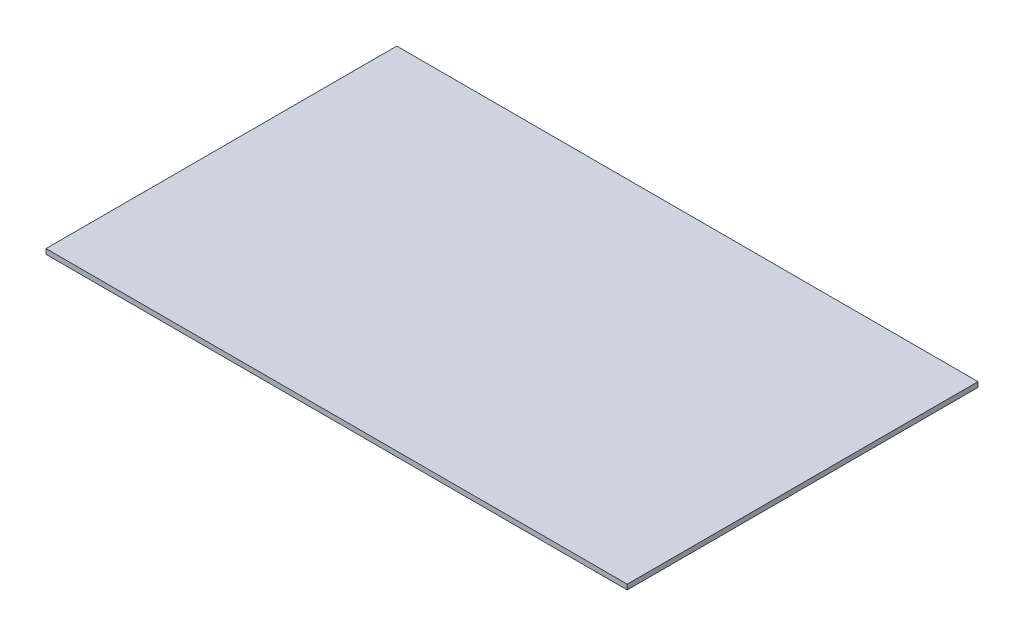
ISO-10303-21;
HEADER;
FILE_DESCRIPTION(('STEP AP214'),'2;1');
FILE_NAME('part.step','',(''),(''),'','','');
FILE_SCHEMA(('AUTOMOTIVE_DESIGN { 1 0 10303 214 1 1 1 1 }'));
ENDSEC;
DATA;
#1=APPLICATION_CONTEXT('core data for automotive mechanical design processes');
#2=APPLICATION_PROTOCOL_DEFINITION('international standard','automotive_design',2000,#1);
#3=PRODUCT_CONTEXT('',#1,'mechanical');
#4=PRODUCT('Part','Part','',(#3));
#5=PRODUCT_RELATED_PRODUCT_CATEGORY('part','',(#4));
#6=PRODUCT_DEFINITION_FORMATION('','',#4);
#7=PRODUCT_DEFINITION_CONTEXT('part definition',#1,'design');
#8=PRODUCT_DEFINITION('design','',#6,#7);
#9=PRODUCT_DEFINITION_SHAPE('','',#8);
#10=(LENGTH_UNIT() NAMED_UNIT(*) SI_UNIT(.MILLI.,.METRE.));
#11=(NAMED_UNIT(*) PLANE_ANGLE_UNIT() SI_UNIT($,.RADIAN.));
#12=(NAMED_UNIT(*) SI_UNIT($,.STERADIAN.) SOLID_ANGLE_UNIT());
#13=UNCERTAINTY_MEASURE_WITH_UNIT(LENGTH_MEASURE(1.E-05),#10,'distance_accuracy_value','');
#14=(GEOMETRIC_REPRESENTATION_CONTEXT(3) GLOBAL_UNCERTAINTY_ASSIGNED_CONTEXT((#13)) GLOBAL_UNIT_ASSIGNED_CONTEXT((#10,
#11,#12)) REPRESENTATION_CONTEXT('',''));
#15=CARTESIAN_POINT('',(0.,0.,0.));
#16=DIRECTION('',(0.,0.,1.));
#17=DIRECTION('',(1.,0.,0.));
#18=AXIS2_PLACEMENT_3D('',#15,#16,#17);
#19=CARTESIAN_POINT('',(0.,1.,0.));
#20=DIRECTION('',(1.,0.,0.));
#21=DIRECTION('',(0.,0.,-1.));
#22=AXIS2_PLACEMENT_3D('',#19,#20,#21);
#23=PLANE('',#22);
#24=DIRECTION('',(0.,0.,1.));
#25=VECTOR('',#24,1.);
#26=CARTESIAN_POINT('',(0.,0.,0.));
#27=LINE('',#26,#25);
#28=CARTESIAN_POINT('',(0.,0.,-70.));
#29=VERTEX_POINT('',#28);
#30=CARTESIAN_POINT('',(0.,0.,0.));
#31=VERTEX_POINT('',#30);
#32=EDGE_CURVE('E99',#29,#31,#27,.T.);
#33=ORIENTED_EDGE('',*,*,#32,.T.);
#34=DIRECTION('',(0.,-1.,0.));
#35=VECTOR('',#34,1.);
#36=CARTESIAN_POINT('',(0.,1.,0.));
#37=LINE('',#36,#35);
#38=CARTESIAN_POINT('',(0.,1.,0.));
#39=VERTEX_POINT('',#38);
#40=EDGE_CURVE('E11',#39,#31,#37,.T.);
#41=ORIENTED_EDGE('',*,*,#40,.F.);
#42=DIRECTION('',(0.,0.,1.));
#43=VECTOR('',#42,1.);
#44=CARTESIAN_POINT('',(0.,1.,0.));
#45=LINE('',#44,#43);
#46=CARTESIAN_POINT('',(0.,1.,-70.));
#47=VERTEX_POINT('',#46);
#48=EDGE_CURVE('E87',#47,#39,#45,.T.);
#49=ORIENTED_EDGE('',*,*,#48,.F.);
#50=DIRECTION('',(0.,-1.,0.));
#51=VECTOR('',#50,1.);
#52=CARTESIAN_POINT('',(0.,1.,-70.));
#53=LINE('',#52,#51);
#54=EDGE_CURVE('E95',#47,#29,#53,.T.);
#55=ORIENTED_EDGE('',*,*,#54,.T.);
#56=EDGE_LOOP('',(#33,#41,#49,#55));
#57=FACE_BOUND('',#56,.T.);
#58=ADVANCED_FACE('F36',(#57),#23,.F.);
#59=CARTESIAN_POINT('',(0.,1.,0.));
#60=DIRECTION('',(0.,0.,-1.));
#61=DIRECTION('',(-1.,0.,0.));
#62=AXIS2_PLACEMENT_3D('',#59,#60,#61);
#63=PLANE('',#62);
#64=DIRECTION('',(1.,0.,0.));
#65=VECTOR('',#64,1.);
#66=CARTESIAN_POINT('',(0.,0.,0.));
#67=LINE('',#66,#65);
#68=CARTESIAN_POINT('',(116.,0.,0.));
#69=VERTEX_POINT('',#68);
#70=EDGE_CURVE('E91',#31,#69,#67,.T.);
#71=ORIENTED_EDGE('',*,*,#70,.T.);
#72=DIRECTION('',(0.,-1.,0.));
#73=VECTOR('',#72,1.);
#74=CARTESIAN_POINT('',(116.,1.,0.));
#75=LINE('',#74,#73);
#76=CARTESIAN_POINT('',(116.,1.,0.));
#77=VERTEX_POINT('',#76);
#78=EDGE_CURVE('E44',#77,#69,#75,.T.);
#79=ORIENTED_EDGE('',*,*,#78,.F.);
#80=DIRECTION('',(1.,0.,0.));
#81=VECTOR('',#80,1.);
#82=CARTESIAN_POINT('',(0.,1.,0.));
#83=LINE('',#82,#81);
#84=EDGE_CURVE('E82',#39,#77,#83,.T.);
#85=ORIENTED_EDGE('',*,*,#84,.F.);
#86=ORIENTED_EDGE('',*,*,#40,.T.);
#87=EDGE_LOOP('',(#71,#79,#85,#86));
#88=FACE_BOUND('',#87,.T.);
#89=ADVANCED_FACE('F90',(#88),#63,.F.);
#90=CARTESIAN_POINT('',(116.,1.,0.));
#91=DIRECTION('',(-1.,0.,0.));
#92=DIRECTION('',(0.,0.,1.));
#93=AXIS2_PLACEMENT_3D('',#90,#91,#92);
#94=PLANE('',#93);
#95=DIRECTION('',(0.,0.,-1.));
#96=VECTOR('',#95,1.);
#97=CARTESIAN_POINT('',(116.,0.,0.));
#98=LINE('',#97,#96);
#99=CARTESIAN_POINT('',(116.,0.,-70.));
#100=VERTEX_POINT('',#99);
#101=EDGE_CURVE('E69',#69,#100,#98,.T.);
#102=ORIENTED_EDGE('',*,*,#101,.T.);
#103=DIRECTION('',(0.,-1.,0.));
#104=VECTOR('',#103,1.);
#105=CARTESIAN_POINT('',(116.,1.,-70.));
#106=LINE('',#105,#104);
#107=CARTESIAN_POINT('',(116.,1.,-70.));
#108=VERTEX_POINT('',#107);
#109=EDGE_CURVE('E92',#108,#100,#106,.T.);
#110=ORIENTED_EDGE('',*,*,#109,.F.);
#111=DIRECTION('',(0.,0.,-1.));
#112=VECTOR('',#111,1.);
#113=CARTESIAN_POINT('',(116.,1.,0.));
#114=LINE('',#113,#112);
#115=EDGE_CURVE('E85',#77,#108,#114,.T.);
#116=ORIENTED_EDGE('',*,*,#115,.F.);
#117=ORIENTED_EDGE('',*,*,#78,.T.);
#118=EDGE_LOOP('',(#102,#110,#116,#117));
#119=FACE_BOUND('',#118,.T.);
#120=ADVANCED_FACE('F93',(#119),#94,.F.);
#121=CARTESIAN_POINT('',(0.,1.,-70.));
#122=DIRECTION('',(0.,0.,1.));
#123=DIRECTION('',(1.,0.,0.));
#124=AXIS2_PLACEMENT_3D('',#121,#122,#123);
#125=PLANE('',#124);
#126=DIRECTION('',(-1.,0.,0.));
#127=VECTOR('',#126,1.);
#128=CARTESIAN_POINT('',(0.,0.,-70.));
#129=LINE('',#128,#127);
#130=EDGE_CURVE('E75',#100,#29,#129,.T.);
#131=ORIENTED_EDGE('',*,*,#130,.T.);
#132=ORIENTED_EDGE('',*,*,#54,.F.);
#133=DIRECTION('',(-1.,0.,0.));
#134=VECTOR('',#133,1.);
#135=CARTESIAN_POINT('',(0.,1.,-70.));
#136=LINE('',#135,#134);
#137=EDGE_CURVE('E52',#108,#47,#136,.T.);
#138=ORIENTED_EDGE('',*,*,#137,.F.);
#139=ORIENTED_EDGE('',*,*,#109,.T.);
#140=EDGE_LOOP('',(#131,#132,#138,#139));
#141=FACE_BOUND('',#140,.T.);
#142=ADVANCED_FACE('F106',(#141),#125,.F.);
#143=CARTESIAN_POINT('',(0.,1.,0.));
#144=DIRECTION('',(0.,-1.,0.));
#145=DIRECTION('',(0.,0.,-1.));
#146=AXIS2_PLACEMENT_3D('',#143,#144,#145);
#147=PLANE('',#146);
#148=ORIENTED_EDGE('',*,*,#48,.T.);
#149=ORIENTED_EDGE('',*,*,#84,.T.);
#150=ORIENTED_EDGE('',*,*,#115,.T.);
#151=ORIENTED_EDGE('',*,*,#137,.T.);
#152=EDGE_LOOP('',(#148,#149,#150,#151));
#153=FACE_BOUND('',#152,.T.);
#154=ADVANCED_FACE('F83',(#153),#147,.F.);
#155=CARTESIAN_POINT('',(0.,0.,0.));
#156=DIRECTION('',(0.,-1.,0.));
#157=DIRECTION('',(0.,0.,-1.));
#158=AXIS2_PLACEMENT_3D('',#155,#156,#157);
#159=PLANE('',#158);
#160=ORIENTED_EDGE('',*,*,#32,.F.);
#161=ORIENTED_EDGE('',*,*,#130,.F.);
#162=ORIENTED_EDGE('',*,*,#101,.F.);
#163=ORIENTED_EDGE('',*,*,#70,.F.);
#164=EDGE_LOOP('',(#160,#161,#162,#163));
#165=FACE_BOUND('',#164,.T.);
#166=ADVANCED_FACE('F109',(#165),#159,.T.);
#167=CLOSED_SHELL('',(#58,#89,#120,#142,#154,#166));
#168=MANIFOLD_SOLID_BREP('B2',#167);
#169=ADVANCED_BREP_SHAPE_REPRESENTATION('',(#18,#168),#14);
#170=SHAPE_DEFINITION_REPRESENTATION(#9,#169);
ENDSEC;
END-ISO-10303-21;
